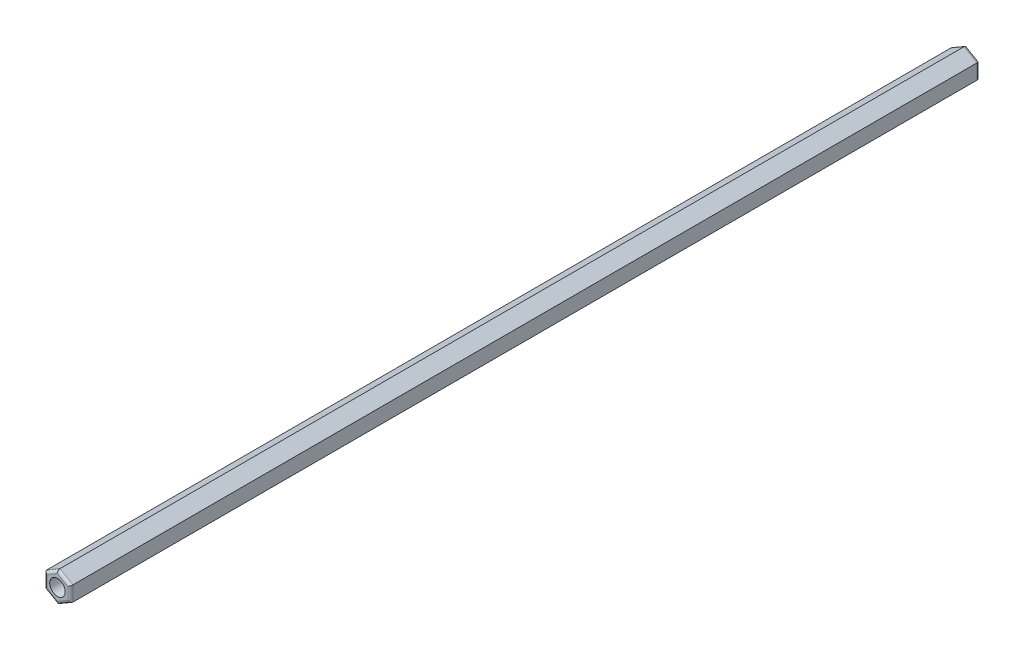
ISO-10303-21;
HEADER;
FILE_DESCRIPTION(('STEP AP214'),'2;1');
FILE_NAME('part.step','',(''),(''),'','','');
FILE_SCHEMA(('AUTOMOTIVE_DESIGN { 1 0 10303 214 1 1 1 1 }'));
ENDSEC;
DATA;
#1=APPLICATION_CONTEXT('core data for automotive mechanical design processes');
#2=APPLICATION_PROTOCOL_DEFINITION('international standard','automotive_design',2000,#1);
#3=PRODUCT_CONTEXT('',#1,'mechanical');
#4=PRODUCT('Part','Part','',(#3));
#5=PRODUCT_RELATED_PRODUCT_CATEGORY('part','',(#4));
#6=PRODUCT_DEFINITION_FORMATION('','',#4);
#7=PRODUCT_DEFINITION_CONTEXT('part definition',#1,'design');
#8=PRODUCT_DEFINITION('design','',#6,#7);
#9=PRODUCT_DEFINITION_SHAPE('','',#8);
#10=(LENGTH_UNIT() NAMED_UNIT(*) SI_UNIT(.MILLI.,.METRE.));
#11=(NAMED_UNIT(*) PLANE_ANGLE_UNIT() SI_UNIT($,.RADIAN.));
#12=(NAMED_UNIT(*) SI_UNIT($,.STERADIAN.) SOLID_ANGLE_UNIT());
#13=UNCERTAINTY_MEASURE_WITH_UNIT(LENGTH_MEASURE(1.E-05),#10,'distance_accuracy_value','');
#14=(GEOMETRIC_REPRESENTATION_CONTEXT(3) GLOBAL_UNCERTAINTY_ASSIGNED_CONTEXT((#13)) GLOBAL_UNIT_ASSIGNED_CONTEXT((#10,
#11,#12)) REPRESENTATION_CONTEXT('',''));
#15=CARTESIAN_POINT('',(0.,0.,0.));
#16=DIRECTION('',(0.,0.,1.));
#17=DIRECTION('',(1.,0.,0.));
#18=AXIS2_PLACEMENT_3D('',#15,#16,#17);
#19=CARTESIAN_POINT('',(-67.50212267549,1.44337567297406,175.));
#20=DIRECTION('',(1.,0.,0.));
#21=DIRECTION('',(0.,0.,-1.));
#22=AXIS2_PLACEMENT_3D('',#19,#20,#21);
#23=PLANE('',#22);
#24=DIRECTION('',(0.,0.,-1.));
#25=VECTOR('',#24,1.);
#26=CARTESIAN_POINT('',(-67.50212267549,-1.44337567297407,175.));
#27=LINE('',#26,#25);
#28=CARTESIAN_POINT('',(-67.50212267549,-1.44337567297407,174.5));
#29=VERTEX_POINT('',#28);
#30=CARTESIAN_POINT('',(-67.50212267549,-1.44337567297407,0.5));
#31=VERTEX_POINT('',#30);
#32=EDGE_CURVE('E157',#29,#31,#27,.T.);
#33=ORIENTED_EDGE('',*,*,#32,.T.);
#34=DIRECTION('',(0.,-1.,0.));
#35=VECTOR('',#34,1.);
#36=CARTESIAN_POINT('',(-67.50212267549,1.44337567297406,0.5));
#37=LINE('',#36,#35);
#38=CARTESIAN_POINT('',(-67.50212267549,1.44337567297406,0.5));
#39=VERTEX_POINT('',#38);
#40=EDGE_CURVE('E154',#31,#39,#37,.F.);
#41=ORIENTED_EDGE('',*,*,#40,.T.);
#42=DIRECTION('',(0.,0.,-1.));
#43=VECTOR('',#42,1.);
#44=CARTESIAN_POINT('',(-67.50212267549,1.44337567297406,175.));
#45=LINE('',#44,#43);
#46=CARTESIAN_POINT('',(-67.50212267549,1.44337567297406,174.5));
#47=VERTEX_POINT('',#46);
#48=EDGE_CURVE('E151',#47,#39,#45,.T.);
#49=ORIENTED_EDGE('',*,*,#48,.F.);
#50=DIRECTION('',(0.,-1.,0.));
#51=VECTOR('',#50,1.);
#52=CARTESIAN_POINT('',(-67.50212267549,-1.44337567297407,174.5));
#53=LINE('',#52,#51);
#54=EDGE_CURVE('E211',#47,#29,#53,.T.);
#55=ORIENTED_EDGE('',*,*,#54,.T.);
#56=EDGE_LOOP('',(#33,#41,#49,#55));
#57=FACE_BOUND('',#56,.T.);
#58=ADVANCED_FACE('F37',(#57),#23,.T.);
#59=CARTESIAN_POINT('',(-70.00212267549,2.88675134594811,175.));
#60=DIRECTION('',(0.5,0.866025403784439,0.));
#61=DIRECTION('',(-0.866025403784439,0.5,0.));
#62=AXIS2_PLACEMENT_3D('',#59,#60,#61);
#63=PLANE('',#62);
#64=ORIENTED_EDGE('',*,*,#48,.T.);
#65=DIRECTION('',(0.866025403784439,-0.5,0.));
#66=VECTOR('',#65,1.);
#67=CARTESIAN_POINT('',(-70.00212267549,2.88675134594811,0.5));
#68=LINE('',#67,#66);
#69=CARTESIAN_POINT('',(-70.00212267549,2.88675134594811,0.5));
#70=VERTEX_POINT('',#69);
#71=EDGE_CURVE('E196',#39,#70,#68,.F.);
#72=ORIENTED_EDGE('',*,*,#71,.T.);
#73=DIRECTION('',(0.,0.,-1.));
#74=VECTOR('',#73,1.);
#75=CARTESIAN_POINT('',(-70.00212267549,2.88675134594811,175.));
#76=LINE('',#75,#74);
#77=CARTESIAN_POINT('',(-70.00212267549,2.88675134594811,174.5));
#78=VERTEX_POINT('',#77);
#79=EDGE_CURVE('E260',#78,#70,#76,.T.);
#80=ORIENTED_EDGE('',*,*,#79,.F.);
#81=DIRECTION('',(0.866025403784439,-0.5,0.));
#82=VECTOR('',#81,1.);
#83=CARTESIAN_POINT('',(-67.50212267549,1.44337567297406,174.5));
#84=LINE('',#83,#82);
#85=EDGE_CURVE('E202',#78,#47,#84,.T.);
#86=ORIENTED_EDGE('',*,*,#85,.T.);
#87=EDGE_LOOP('',(#64,#72,#80,#86));
#88=FACE_BOUND('',#87,.T.);
#89=ADVANCED_FACE('F289',(#88),#63,.T.);
#90=CARTESIAN_POINT('',(-72.50212267549,1.44337567297405,175.));
#91=DIRECTION('',(-0.5,0.866025403784438,0.));
#92=DIRECTION('',(-0.866025403784439,-0.5,0.));
#93=AXIS2_PLACEMENT_3D('',#90,#91,#92);
#94=PLANE('',#93);
#95=ORIENTED_EDGE('',*,*,#79,.T.);
#96=DIRECTION('',(0.866025403784439,0.5,0.));
#97=VECTOR('',#96,1.);
#98=CARTESIAN_POINT('',(-72.50212267549,1.44337567297405,0.5));
#99=LINE('',#98,#97);
#100=CARTESIAN_POINT('',(-72.50212267549,1.44337567297405,0.5));
#101=VERTEX_POINT('',#100);
#102=EDGE_CURVE('E236',#70,#101,#99,.F.);
#103=ORIENTED_EDGE('',*,*,#102,.T.);
#104=DIRECTION('',(0.,0.,-1.));
#105=VECTOR('',#104,1.);
#106=CARTESIAN_POINT('',(-72.50212267549,1.44337567297405,175.));
#107=LINE('',#106,#105);
#108=CARTESIAN_POINT('',(-72.50212267549,1.44337567297405,174.5));
#109=VERTEX_POINT('',#108);
#110=EDGE_CURVE('E258',#109,#101,#107,.T.);
#111=ORIENTED_EDGE('',*,*,#110,.F.);
#112=DIRECTION('',(0.866025403784439,0.5,0.));
#113=VECTOR('',#112,1.);
#114=CARTESIAN_POINT('',(-70.00212267549,2.88675134594811,174.5));
#115=LINE('',#114,#113);
#116=EDGE_CURVE('E239',#109,#78,#115,.T.);
#117=ORIENTED_EDGE('',*,*,#116,.T.);
#118=EDGE_LOOP('',(#95,#103,#111,#117));
#119=FACE_BOUND('',#118,.T.);
#120=ADVANCED_FACE('F295',(#119),#94,.T.);
#121=CARTESIAN_POINT('',(-72.50212267549,-1.44337567297407,175.));
#122=DIRECTION('',(-1.,0.,0.));
#123=DIRECTION('',(0.,0.,1.));
#124=AXIS2_PLACEMENT_3D('',#121,#122,#123);
#125=PLANE('',#124);
#126=ORIENTED_EDGE('',*,*,#110,.T.);
#127=DIRECTION('',(0.,1.,0.));
#128=VECTOR('',#127,1.);
#129=CARTESIAN_POINT('',(-72.50212267549,-1.44337567297407,0.5));
#130=LINE('',#129,#128);
#131=CARTESIAN_POINT('',(-72.50212267549,-1.44337567297407,0.5));
#132=VERTEX_POINT('',#131);
#133=EDGE_CURVE('E206',#101,#132,#130,.F.);
#134=ORIENTED_EDGE('',*,*,#133,.T.);
#135=DIRECTION('',(0.,0.,-1.));
#136=VECTOR('',#135,1.);
#137=CARTESIAN_POINT('',(-72.50212267549,-1.44337567297407,175.));
#138=LINE('',#137,#136);
#139=CARTESIAN_POINT('',(-72.50212267549,-1.44337567297407,174.5));
#140=VERTEX_POINT('',#139);
#141=EDGE_CURVE('E255',#140,#132,#138,.T.);
#142=ORIENTED_EDGE('',*,*,#141,.F.);
#143=DIRECTION('',(0.,1.,0.));
#144=VECTOR('',#143,1.);
#145=CARTESIAN_POINT('',(-72.50212267549,1.44337567297405,174.5));
#146=LINE('',#145,#144);
#147=EDGE_CURVE('E231',#140,#109,#146,.T.);
#148=ORIENTED_EDGE('',*,*,#147,.T.);
#149=EDGE_LOOP('',(#126,#134,#142,#148));
#150=FACE_BOUND('',#149,.T.);
#151=ADVANCED_FACE('F346',(#150),#125,.T.);
#152=CARTESIAN_POINT('',(-70.00212267549,-2.88675134594813,175.));
#153=DIRECTION('',(-0.499999999999999,-0.866025403784439,0.));
#154=DIRECTION('',(0.866025403784439,-0.499999999999999,0.));
#155=AXIS2_PLACEMENT_3D('',#152,#153,#154);
#156=PLANE('',#155);
#157=ORIENTED_EDGE('',*,*,#141,.T.);
#158=DIRECTION('',(-0.866025403784439,0.499999999999999,0.));
#159=VECTOR('',#158,1.);
#160=CARTESIAN_POINT('',(-70.00212267549,-2.88675134594813,0.5));
#161=LINE('',#160,#159);
#162=CARTESIAN_POINT('',(-70.00212267549,-2.88675134594813,0.5));
#163=VERTEX_POINT('',#162);
#164=EDGE_CURVE('E204',#132,#163,#161,.F.);
#165=ORIENTED_EDGE('',*,*,#164,.T.);
#166=DIRECTION('',(0.,0.,-1.));
#167=VECTOR('',#166,1.);
#168=CARTESIAN_POINT('',(-70.00212267549,-2.88675134594813,175.));
#169=LINE('',#168,#167);
#170=CARTESIAN_POINT('',(-70.00212267549,-2.88675134594813,174.5));
#171=VERTEX_POINT('',#170);
#172=EDGE_CURVE('E252',#171,#163,#169,.T.);
#173=ORIENTED_EDGE('',*,*,#172,.F.);
#174=DIRECTION('',(-0.866025403784439,0.499999999999999,0.));
#175=VECTOR('',#174,1.);
#176=CARTESIAN_POINT('',(-72.50212267549,-1.44337567297407,174.5));
#177=LINE('',#176,#175);
#178=EDGE_CURVE('E201',#171,#140,#177,.T.);
#179=ORIENTED_EDGE('',*,*,#178,.T.);
#180=EDGE_LOOP('',(#157,#165,#173,#179));
#181=FACE_BOUND('',#180,.T.);
#182=ADVANCED_FACE('F285',(#181),#156,.T.);
#183=CARTESIAN_POINT('',(-67.50212267549,-1.44337567297407,175.));
#184=DIRECTION('',(0.500000000000001,-0.866025403784438,0.));
#185=DIRECTION('',(0.866025403784438,0.500000000000001,0.));
#186=AXIS2_PLACEMENT_3D('',#183,#184,#185);
#187=PLANE('',#186);
#188=ORIENTED_EDGE('',*,*,#172,.T.);
#189=DIRECTION('',(-0.866025403784438,-0.500000000000001,0.));
#190=VECTOR('',#189,1.);
#191=CARTESIAN_POINT('',(-67.50212267549,-1.44337567297407,0.5));
#192=LINE('',#191,#190);
#193=EDGE_CURVE('E216',#163,#31,#192,.F.);
#194=ORIENTED_EDGE('',*,*,#193,.T.);
#195=ORIENTED_EDGE('',*,*,#32,.F.);
#196=DIRECTION('',(-0.866025403784438,-0.500000000000001,0.));
#197=VECTOR('',#196,1.);
#198=CARTESIAN_POINT('',(-70.00212267549,-2.88675134594813,174.5));
#199=LINE('',#198,#197);
#200=EDGE_CURVE('E214',#29,#171,#199,.T.);
#201=ORIENTED_EDGE('',*,*,#200,.T.);
#202=EDGE_LOOP('',(#188,#194,#195,#201));
#203=FACE_BOUND('',#202,.T.);
#204=ADVANCED_FACE('F278',(#203),#187,.T.);
#205=CARTESIAN_POINT('',(0.,0.,175.));
#206=DIRECTION('',(0.,0.,-1.));
#207=DIRECTION('',(-1.,0.,0.));
#208=AXIS2_PLACEMENT_3D('',#205,#206,#207);
#209=PLANE('',#208);
#210=CARTESIAN_POINT('',(-70.00212267549,0.,175.));
#211=DIRECTION('',(0.,0.,1.));
#212=DIRECTION('',(1.,0.,0.));
#213=AXIS2_PLACEMENT_3D('',#210,#211,#212);
#214=CIRCLE('',#213,1.5);
#215=CARTESIAN_POINT('',(-68.50212267549,0.,175.));
#216=VERTEX_POINT('',#215);
#217=EDGE_CURVE('E263',#216,#216,#214,.T.);
#218=ORIENTED_EDGE('',*,*,#217,.F.);
#219=EDGE_LOOP('',(#218));
#220=FACE_BOUND('',#219,.T.);
#221=DIRECTION('',(0.866025403784439,-0.5,0.));
#222=VECTOR('',#221,1.);
#223=CARTESIAN_POINT('',(-70.25212267549,2.45373864405589,175.));
#224=LINE('',#223,#222);
#225=CARTESIAN_POINT('',(-68.00212267549,1.15470053837924,175.));
#226=VERTEX_POINT('',#225);
#227=CARTESIAN_POINT('',(-70.00212267549,2.30940107675849,175.));
#228=VERTEX_POINT('',#227);
#229=EDGE_CURVE('E61',#226,#228,#224,.F.);
#230=ORIENTED_EDGE('',*,*,#229,.T.);
#231=DIRECTION('',(0.866025403784439,0.5,0.));
#232=VECTOR('',#231,1.);
#233=CARTESIAN_POINT('',(-72.25212267549,1.01036297108183,175.));
#234=LINE('',#233,#232);
#235=CARTESIAN_POINT('',(-72.00212267549,1.15470053837923,175.));
#236=VERTEX_POINT('',#235);
#237=EDGE_CURVE('E11',#228,#236,#234,.F.);
#238=ORIENTED_EDGE('',*,*,#237,.T.);
#239=DIRECTION('',(0.,1.,0.));
#240=VECTOR('',#239,1.);
#241=CARTESIAN_POINT('',(-72.00212267549,-1.44337567297407,175.));
#242=LINE('',#241,#240);
#243=CARTESIAN_POINT('',(-72.00212267549,-1.15470053837925,175.));
#244=VERTEX_POINT('',#243);
#245=EDGE_CURVE('E46',#236,#244,#242,.F.);
#246=ORIENTED_EDGE('',*,*,#245,.T.);
#247=DIRECTION('',(-0.866025403784439,0.499999999999999,0.));
#248=VECTOR('',#247,1.);
#249=CARTESIAN_POINT('',(-69.75212267549,-2.45373864405591,175.));
#250=LINE('',#249,#248);
#251=CARTESIAN_POINT('',(-70.00212267549,-2.3094010767585,175.));
#252=VERTEX_POINT('',#251);
#253=EDGE_CURVE('E222',#244,#252,#250,.F.);
#254=ORIENTED_EDGE('',*,*,#253,.T.);
#255=DIRECTION('',(-0.866025403784438,-0.500000000000001,0.));
#256=VECTOR('',#255,1.);
#257=CARTESIAN_POINT('',(-67.75212267549,-1.01036297108185,175.));
#258=LINE('',#257,#256);
#259=CARTESIAN_POINT('',(-68.00212267549,-1.15470053837926,175.));
#260=VERTEX_POINT('',#259);
#261=EDGE_CURVE('E218',#252,#260,#258,.F.);
#262=ORIENTED_EDGE('',*,*,#261,.T.);
#263=DIRECTION('',(0.,-1.,0.));
#264=VECTOR('',#263,1.);
#265=CARTESIAN_POINT('',(-68.00212267549,1.44337567297406,175.));
#266=LINE('',#265,#264);
#267=EDGE_CURVE('E220',#260,#226,#266,.F.);
#268=ORIENTED_EDGE('',*,*,#267,.T.);
#269=EDGE_LOOP('',(#230,#238,#246,#254,#262,#268));
#270=FACE_BOUND('',#269,.T.);
#271=ADVANCED_FACE('F224',(#220,#270),#209,.F.);
#272=CARTESIAN_POINT('',(0.,0.,0.));
#273=DIRECTION('',(0.,0.,-1.));
#274=DIRECTION('',(-1.,0.,0.));
#275=AXIS2_PLACEMENT_3D('',#272,#273,#274);
#276=PLANE('',#275);
#277=CARTESIAN_POINT('',(-70.00212267549,0.,0.));
#278=DIRECTION('',(0.,0.,1.));
#279=DIRECTION('',(1.,0.,0.));
#280=AXIS2_PLACEMENT_3D('',#277,#278,#279);
#281=CIRCLE('',#280,1.5);
#282=CARTESIAN_POINT('',(-68.50212267549,0.,0.));
#283=VERTEX_POINT('',#282);
#284=EDGE_CURVE('E166',#283,#283,#281,.T.);
#285=ORIENTED_EDGE('',*,*,#284,.T.);
#286=EDGE_LOOP('',(#285));
#287=FACE_BOUND('',#286,.T.);
#288=DIRECTION('',(0.,1.,0.));
#289=VECTOR('',#288,1.);
#290=CARTESIAN_POINT('',(-72.00212267549,0.,0.));
#291=LINE('',#290,#289);
#292=CARTESIAN_POINT('',(-72.00212267549,-1.15470053837926,0.));
#293=VERTEX_POINT('',#292);
#294=CARTESIAN_POINT('',(-72.00212267549,1.15470053837924,0.));
#295=VERTEX_POINT('',#294);
#296=EDGE_CURVE('E246',#293,#295,#291,.T.);
#297=ORIENTED_EDGE('',*,*,#296,.T.);
#298=DIRECTION('',(0.866025403784439,0.5,0.));
#299=VECTOR('',#298,1.);
#300=CARTESIAN_POINT('',(-18.5005306688725,32.0438590854734,0.));
#301=LINE('',#300,#299);
#302=CARTESIAN_POINT('',(-70.00212267549,2.30940107675849,0.));
#303=VERTEX_POINT('',#302);
#304=EDGE_CURVE('E244',#295,#303,#301,.T.);
#305=ORIENTED_EDGE('',*,*,#304,.T.);
#306=DIRECTION('',(0.866025403784439,-0.5,0.));
#307=VECTOR('',#306,1.);
#308=CARTESIAN_POINT('',(-16.5005306688725,-28.5797574703356,0.));
#309=LINE('',#308,#307);
#310=CARTESIAN_POINT('',(-68.00212267549,1.15470053837924,0.));
#311=VERTEX_POINT('',#310);
#312=EDGE_CURVE('E135',#303,#311,#309,.T.);
#313=ORIENTED_EDGE('',*,*,#312,.T.);
#314=DIRECTION('',(0.,-1.,0.));
#315=VECTOR('',#314,1.);
#316=CARTESIAN_POINT('',(-68.00212267549,0.,0.));
#317=LINE('',#316,#315);
#318=CARTESIAN_POINT('',(-68.00212267549,-1.15470053837924,0.));
#319=VERTEX_POINT('',#318);
#320=EDGE_CURVE('E128',#311,#319,#317,.T.);
#321=ORIENTED_EDGE('',*,*,#320,.T.);
#322=DIRECTION('',(-0.866025403784438,-0.500000000000001,0.));
#323=VECTOR('',#322,1.);
#324=CARTESIAN_POINT('',(-16.5005306688726,28.5797574703357,0.));
#325=LINE('',#324,#323);
#326=CARTESIAN_POINT('',(-70.00212267549,-2.3094010767585,0.));
#327=VERTEX_POINT('',#326);
#328=EDGE_CURVE('E131',#319,#327,#325,.T.);
#329=ORIENTED_EDGE('',*,*,#328,.T.);
#330=DIRECTION('',(-0.866025403784439,0.499999999999999,0.));
#331=VECTOR('',#330,1.);
#332=CARTESIAN_POINT('',(-18.5005306688724,-32.0438590854734,0.));
#333=LINE('',#332,#331);
#334=EDGE_CURVE('E140',#327,#293,#333,.T.);
#335=ORIENTED_EDGE('',*,*,#334,.T.);
#336=EDGE_LOOP('',(#297,#305,#313,#321,#329,#335));
#337=FACE_BOUND('',#336,.T.);
#338=ADVANCED_FACE('F130',(#287,#337),#276,.T.);
#339=CARTESIAN_POINT('',(-16.5005306688726,28.5797574703357,0.5));
#340=DIRECTION('',(-0.866025403784438,-0.500000000000001,0.));
#341=DIRECTION('',(0.500000000000001,-0.866025403784438,0.));
#342=AXIS2_PLACEMENT_3D('',#339,#340,#341);
#343=CYLINDRICAL_SURFACE('',#342,0.5);
#344=CARTESIAN_POINT('',(-68.00212267549,-1.15470053837925,0.5));
#345=DIRECTION('',(-0.5,-0.866025403784439,0.));
#346=DIRECTION('',(-0.866025403784439,0.499999999999999,0.));
#347=AXIS2_PLACEMENT_3D('',#344,#345,#346);
#348=ELLIPSE('',#347,0.577350269189626,0.5);
#349=EDGE_CURVE('E146',#31,#319,#348,.F.);
#350=ORIENTED_EDGE('',*,*,#349,.F.);
#351=ORIENTED_EDGE('',*,*,#193,.F.);
#352=CARTESIAN_POINT('',(-70.00212267549,-2.30940107675849,0.5));
#353=DIRECTION('',(-1.,0.,0.));
#354=DIRECTION('',(0.,-1.,0.));
#355=AXIS2_PLACEMENT_3D('',#352,#353,#354);
#356=ELLIPSE('',#355,0.577350269189626,0.5);
#357=EDGE_CURVE('E149',#327,#163,#356,.T.);
#358=ORIENTED_EDGE('',*,*,#357,.F.);
#359=ORIENTED_EDGE('',*,*,#328,.F.);
#360=EDGE_LOOP('',(#350,#351,#358,#359));
#361=FACE_BOUND('',#360,.T.);
#362=ADVANCED_FACE('F144',(#361),#343,.T.);
#363=CARTESIAN_POINT('',(-18.5005306688724,-32.0438590854734,0.5));
#364=DIRECTION('',(-0.866025403784439,0.499999999999999,0.));
#365=DIRECTION('',(-0.499999999999999,-0.866025403784439,0.));
#366=AXIS2_PLACEMENT_3D('',#363,#364,#365);
#367=CYLINDRICAL_SURFACE('',#366,0.5);
#368=ORIENTED_EDGE('',*,*,#357,.T.);
#369=ORIENTED_EDGE('',*,*,#164,.F.);
#370=CARTESIAN_POINT('',(-72.00212267549,-1.15470053837926,0.5));
#371=DIRECTION('',(-0.500000000000001,0.866025403784438,0.));
#372=DIRECTION('',(-0.866025403784438,-0.5,0.));
#373=AXIS2_PLACEMENT_3D('',#370,#371,#372);
#374=ELLIPSE('',#373,0.577350269189626,0.5);
#375=EDGE_CURVE('E155',#293,#132,#374,.T.);
#376=ORIENTED_EDGE('',*,*,#375,.F.);
#377=ORIENTED_EDGE('',*,*,#334,.F.);
#378=EDGE_LOOP('',(#368,#369,#376,#377));
#379=FACE_BOUND('',#378,.T.);
#380=ADVANCED_FACE('F310',(#379),#367,.T.);
#381=CARTESIAN_POINT('',(-68.00212267549,0.,0.5));
#382=DIRECTION('',(0.,-1.,0.));
#383=DIRECTION('',(0.,0.,-1.));
#384=AXIS2_PLACEMENT_3D('',#381,#382,#383);
#385=CYLINDRICAL_SURFACE('',#384,0.5);
#386=ORIENTED_EDGE('',*,*,#349,.T.);
#387=ORIENTED_EDGE('',*,*,#320,.F.);
#388=CARTESIAN_POINT('',(-68.00212267549,1.15470053837926,0.5));
#389=DIRECTION('',(0.5,-0.866025403784439,0.));
#390=DIRECTION('',(-0.866025403784439,-0.5,0.));
#391=AXIS2_PLACEMENT_3D('',#388,#389,#390);
#392=ELLIPSE('',#391,0.577350269189626,0.5);
#393=EDGE_CURVE('E160',#39,#311,#392,.F.);
#394=ORIENTED_EDGE('',*,*,#393,.F.);
#395=ORIENTED_EDGE('',*,*,#40,.F.);
#396=EDGE_LOOP('',(#386,#387,#394,#395));
#397=FACE_BOUND('',#396,.T.);
#398=ADVANCED_FACE('F153',(#397),#385,.T.);
#399=CARTESIAN_POINT('',(-72.00212267549,0.,0.5));
#400=DIRECTION('',(0.,1.,0.));
#401=DIRECTION('',(0.,0.,1.));
#402=AXIS2_PLACEMENT_3D('',#399,#400,#401);
#403=CYLINDRICAL_SURFACE('',#402,0.5);
#404=ORIENTED_EDGE('',*,*,#375,.T.);
#405=ORIENTED_EDGE('',*,*,#133,.F.);
#406=CARTESIAN_POINT('',(-72.00212267549,1.15470053837923,0.5));
#407=DIRECTION('',(0.5,0.866025403784439,0.));
#408=DIRECTION('',(-0.866025403784439,0.5,0.));
#409=AXIS2_PLACEMENT_3D('',#406,#407,#408);
#410=ELLIPSE('',#409,0.577350269189626,0.5);
#411=EDGE_CURVE('E185',#295,#101,#410,.T.);
#412=ORIENTED_EDGE('',*,*,#411,.F.);
#413=ORIENTED_EDGE('',*,*,#296,.F.);
#414=EDGE_LOOP('',(#404,#405,#412,#413));
#415=FACE_BOUND('',#414,.T.);
#416=ADVANCED_FACE('F304',(#415),#403,.T.);
#417=CARTESIAN_POINT('',(-16.5005306688725,-28.5797574703356,0.5));
#418=DIRECTION('',(0.866025403784439,-0.5,0.));
#419=DIRECTION('',(0.5,0.866025403784439,0.));
#420=AXIS2_PLACEMENT_3D('',#417,#418,#419);
#421=CYLINDRICAL_SURFACE('',#420,0.5);
#422=ORIENTED_EDGE('',*,*,#393,.T.);
#423=ORIENTED_EDGE('',*,*,#312,.F.);
#424=CARTESIAN_POINT('',(-70.00212267549,2.30940107675848,0.5));
#425=DIRECTION('',(1.,0.,0.));
#426=DIRECTION('',(0.,-1.,0.));
#427=AXIS2_PLACEMENT_3D('',#424,#425,#426);
#428=ELLIPSE('',#427,0.577350269189626,0.5);
#429=EDGE_CURVE('E180',#70,#303,#428,.F.);
#430=ORIENTED_EDGE('',*,*,#429,.F.);
#431=ORIENTED_EDGE('',*,*,#71,.F.);
#432=EDGE_LOOP('',(#422,#423,#430,#431));
#433=FACE_BOUND('',#432,.T.);
#434=ADVANCED_FACE('F195',(#433),#421,.T.);
#435=CARTESIAN_POINT('',(-18.5005306688725,32.0438590854734,0.5));
#436=DIRECTION('',(0.866025403784439,0.5,0.));
#437=DIRECTION('',(-0.5,0.866025403784438,0.));
#438=AXIS2_PLACEMENT_3D('',#435,#436,#437);
#439=CYLINDRICAL_SURFACE('',#438,0.5);
#440=ORIENTED_EDGE('',*,*,#411,.T.);
#441=ORIENTED_EDGE('',*,*,#102,.F.);
#442=ORIENTED_EDGE('',*,*,#429,.T.);
#443=ORIENTED_EDGE('',*,*,#304,.F.);
#444=EDGE_LOOP('',(#440,#441,#442,#443));
#445=FACE_BOUND('',#444,.T.);
#446=ADVANCED_FACE('F299',(#445),#439,.T.);
#447=CARTESIAN_POINT('',(-67.75212267549,-1.01036297108185,174.5));
#448=DIRECTION('',(0.866025403784438,0.500000000000001,0.));
#449=DIRECTION('',(-0.500000000000001,0.866025403784438,0.));
#450=AXIS2_PLACEMENT_3D('',#447,#448,#449);
#451=CYLINDRICAL_SURFACE('',#450,0.5);
#452=CARTESIAN_POINT('',(-68.00212267549,-1.15470053837926,174.5));
#453=DIRECTION('',(0.5,0.866025403784439,0.));
#454=DIRECTION('',(0.866025403784439,-0.499999999999999,0.));
#455=AXIS2_PLACEMENT_3D('',#452,#453,#454);
#456=ELLIPSE('',#455,0.577350269189626,0.5);
#457=EDGE_CURVE('E173',#260,#29,#456,.T.);
#458=ORIENTED_EDGE('',*,*,#457,.F.);
#459=ORIENTED_EDGE('',*,*,#261,.F.);
#460=CARTESIAN_POINT('',(-70.00212267549,-2.3094010767585,174.5));
#461=DIRECTION('',(1.,0.,0.));
#462=DIRECTION('',(0.,1.,0.));
#463=AXIS2_PLACEMENT_3D('',#460,#461,#462);
#464=ELLIPSE('',#463,0.577350269189626,0.5);
#465=EDGE_CURVE('E41',#171,#252,#464,.F.);
#466=ORIENTED_EDGE('',*,*,#465,.F.);
#467=ORIENTED_EDGE('',*,*,#200,.F.);
#468=EDGE_LOOP('',(#458,#459,#466,#467));
#469=FACE_BOUND('',#468,.T.);
#470=ADVANCED_FACE('F39',(#469),#451,.T.);
#471=CARTESIAN_POINT('',(-69.75212267549,-2.45373864405591,174.5));
#472=DIRECTION('',(0.866025403784439,-0.499999999999999,0.));
#473=DIRECTION('',(0.499999999999999,0.866025403784439,0.));
#474=AXIS2_PLACEMENT_3D('',#471,#472,#473);
#475=CYLINDRICAL_SURFACE('',#474,0.5);
#476=ORIENTED_EDGE('',*,*,#465,.T.);
#477=ORIENTED_EDGE('',*,*,#253,.F.);
#478=CARTESIAN_POINT('',(-72.00212267549,-1.15470053837925,174.5));
#479=DIRECTION('',(0.500000000000001,-0.866025403784438,0.));
#480=DIRECTION('',(0.866025403784438,0.5,0.));
#481=AXIS2_PLACEMENT_3D('',#478,#479,#480);
#482=ELLIPSE('',#481,0.577350269189626,0.5);
#483=EDGE_CURVE('E171',#140,#244,#482,.F.);
#484=ORIENTED_EDGE('',*,*,#483,.F.);
#485=ORIENTED_EDGE('',*,*,#178,.F.);
#486=EDGE_LOOP('',(#476,#477,#484,#485));
#487=FACE_BOUND('',#486,.T.);
#488=ADVANCED_FACE('F228',(#487),#475,.T.);
#489=CARTESIAN_POINT('',(-68.00212267549,1.44337567297406,174.5));
#490=DIRECTION('',(0.,1.,0.));
#491=DIRECTION('',(0.,0.,1.));
#492=AXIS2_PLACEMENT_3D('',#489,#490,#491);
#493=CYLINDRICAL_SURFACE('',#492,0.5);
#494=ORIENTED_EDGE('',*,*,#457,.T.);
#495=ORIENTED_EDGE('',*,*,#54,.F.);
#496=CARTESIAN_POINT('',(-68.00212267549,1.15470053837924,174.5));
#497=DIRECTION('',(-0.5,0.866025403784439,0.));
#498=DIRECTION('',(0.866025403784439,0.5,0.));
#499=AXIS2_PLACEMENT_3D('',#496,#497,#498);
#500=ELLIPSE('',#499,0.577350269189626,0.5);
#501=EDGE_CURVE('E168',#226,#47,#500,.T.);
#502=ORIENTED_EDGE('',*,*,#501,.F.);
#503=ORIENTED_EDGE('',*,*,#267,.F.);
#504=EDGE_LOOP('',(#494,#495,#502,#503));
#505=FACE_BOUND('',#504,.T.);
#506=ADVANCED_FACE('F324',(#505),#493,.T.);
#507=CARTESIAN_POINT('',(-72.00212267549,-1.44337567297407,174.5));
#508=DIRECTION('',(0.,-1.,0.));
#509=DIRECTION('',(0.,0.,-1.));
#510=AXIS2_PLACEMENT_3D('',#507,#508,#509);
#511=CYLINDRICAL_SURFACE('',#510,0.5);
#512=ORIENTED_EDGE('',*,*,#483,.T.);
#513=ORIENTED_EDGE('',*,*,#245,.F.);
#514=CARTESIAN_POINT('',(-72.00212267549,1.15470053837923,174.5));
#515=DIRECTION('',(-0.5,-0.866025403784439,0.));
#516=DIRECTION('',(0.866025403784439,-0.5,0.));
#517=AXIS2_PLACEMENT_3D('',#514,#515,#516);
#518=ELLIPSE('',#517,0.577350269189626,0.5);
#519=EDGE_CURVE('E54',#109,#236,#518,.F.);
#520=ORIENTED_EDGE('',*,*,#519,.F.);
#521=ORIENTED_EDGE('',*,*,#147,.F.);
#522=EDGE_LOOP('',(#512,#513,#520,#521));
#523=FACE_BOUND('',#522,.T.);
#524=ADVANCED_FACE('F230',(#523),#511,.T.);
#525=CARTESIAN_POINT('',(-70.25212267549,2.45373864405589,174.5));
#526=DIRECTION('',(-0.866025403784439,0.5,0.));
#527=DIRECTION('',(-0.5,-0.866025403784439,0.));
#528=AXIS2_PLACEMENT_3D('',#525,#526,#527);
#529=CYLINDRICAL_SURFACE('',#528,0.5);
#530=ORIENTED_EDGE('',*,*,#501,.T.);
#531=ORIENTED_EDGE('',*,*,#85,.F.);
#532=CARTESIAN_POINT('',(-70.00212267549,2.30940107675849,174.5));
#533=DIRECTION('',(-1.,0.,0.));
#534=DIRECTION('',(0.,1.,0.));
#535=AXIS2_PLACEMENT_3D('',#532,#533,#534);
#536=ELLIPSE('',#535,0.577350269189626,0.5);
#537=EDGE_CURVE('E164',#228,#78,#536,.T.);
#538=ORIENTED_EDGE('',*,*,#537,.F.);
#539=ORIENTED_EDGE('',*,*,#229,.F.);
#540=EDGE_LOOP('',(#530,#531,#538,#539));
#541=FACE_BOUND('',#540,.T.);
#542=ADVANCED_FACE('F318',(#541),#529,.T.);
#543=CARTESIAN_POINT('',(-72.25212267549,1.01036297108183,174.5));
#544=DIRECTION('',(-0.866025403784439,-0.5,0.));
#545=DIRECTION('',(0.5,-0.866025403784438,0.));
#546=AXIS2_PLACEMENT_3D('',#543,#544,#545);
#547=CYLINDRICAL_SURFACE('',#546,0.5);
#548=ORIENTED_EDGE('',*,*,#519,.T.);
#549=ORIENTED_EDGE('',*,*,#237,.F.);
#550=ORIENTED_EDGE('',*,*,#537,.T.);
#551=ORIENTED_EDGE('',*,*,#116,.F.);
#552=EDGE_LOOP('',(#548,#549,#550,#551));
#553=FACE_BOUND('',#552,.T.);
#554=ADVANCED_FACE('F273',(#553),#547,.T.);
#555=CARTESIAN_POINT('',(-70.00212267549,0.,0.));
#556=DIRECTION('',(0.,0.,1.));
#557=DIRECTION('',(1.,0.,0.));
#558=AXIS2_PLACEMENT_3D('',#555,#556,#557);
#559=CYLINDRICAL_SURFACE('',#558,1.5);
#560=ORIENTED_EDGE('',*,*,#284,.F.);
#561=EDGE_LOOP('',(#560));
#562=FACE_BOUND('',#561,.T.);
#563=ORIENTED_EDGE('',*,*,#217,.T.);
#564=EDGE_LOOP('',(#563));
#565=FACE_BOUND('',#564,.T.);
#566=ADVANCED_FACE('F270',(#562,#565),#559,.F.);
#567=CLOSED_SHELL('',(#58,#89,#120,#151,#182,#204,#271,#338,#362,#380,#398,#416,#434,#446,#470,
#488,#506,#524,#542,#554,#566));
#568=MANIFOLD_SOLID_BREP('B2',#567);
#569=ADVANCED_BREP_SHAPE_REPRESENTATION('',(#18,#568),#14);
#570=SHAPE_DEFINITION_REPRESENTATION(#9,#569);
ENDSEC;
END-ISO-10303-21;
